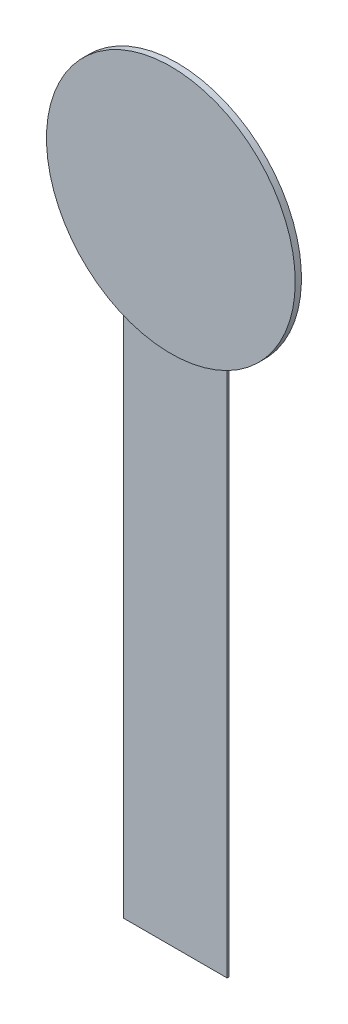
ISO-10303-21;
HEADER;
FILE_DESCRIPTION(('STEP AP214'),'2;1');
FILE_NAME('part.step','',(''),(''),'','','');
FILE_SCHEMA(('AUTOMOTIVE_DESIGN { 1 0 10303 214 1 1 1 1 }'));
ENDSEC;
DATA;
#1=APPLICATION_CONTEXT('core data for automotive mechanical design processes');
#2=APPLICATION_PROTOCOL_DEFINITION('international standard','automotive_design',2000,#1);
#3=PRODUCT_CONTEXT('',#1,'mechanical');
#4=PRODUCT('Part','Part','',(#3));
#5=PRODUCT_RELATED_PRODUCT_CATEGORY('part','',(#4));
#6=PRODUCT_DEFINITION_FORMATION('','',#4);
#7=PRODUCT_DEFINITION_CONTEXT('part definition',#1,'design');
#8=PRODUCT_DEFINITION('design','',#6,#7);
#9=PRODUCT_DEFINITION_SHAPE('','',#8);
#10=(LENGTH_UNIT() NAMED_UNIT(*) SI_UNIT(.MILLI.,.METRE.));
#11=(NAMED_UNIT(*) PLANE_ANGLE_UNIT() SI_UNIT($,.RADIAN.));
#12=(NAMED_UNIT(*) SI_UNIT($,.STERADIAN.) SOLID_ANGLE_UNIT());
#13=UNCERTAINTY_MEASURE_WITH_UNIT(LENGTH_MEASURE(1.E-05),#10,'distance_accuracy_value','');
#14=(GEOMETRIC_REPRESENTATION_CONTEXT(3) GLOBAL_UNCERTAINTY_ASSIGNED_CONTEXT((#13)) GLOBAL_UNIT_ASSIGNED_CONTEXT((#10,
#11,#12)) REPRESENTATION_CONTEXT('',''));
#15=CARTESIAN_POINT('',(0.,0.,0.));
#16=DIRECTION('',(0.,0.,1.));
#17=DIRECTION('',(1.,0.,0.));
#18=AXIS2_PLACEMENT_3D('',#15,#16,#17);
#19=CARTESIAN_POINT('',(0.,0.,0.46));
#20=DIRECTION('',(0.,0.,-1.));
#21=DIRECTION('',(-1.,0.,0.));
#22=AXIS2_PLACEMENT_3D('',#19,#20,#21);
#23=CYLINDRICAL_SURFACE('',#22,9.15);
#24=CARTESIAN_POINT('',(0.,0.,0.46));
#25=DIRECTION('',(0.,0.,1.));
#26=DIRECTION('',(1.,0.,0.));
#27=AXIS2_PLACEMENT_3D('',#24,#25,#26);
#28=CIRCLE('',#27,9.15);
#29=CARTESIAN_POINT('',(9.15,0.,0.46));
#30=VERTEX_POINT('',#29);
#31=EDGE_CURVE('E41',#30,#30,#28,.T.);
#32=ORIENTED_EDGE('',*,*,#31,.F.);
#33=EDGE_LOOP('',(#32));
#34=FACE_BOUND('',#33,.T.);
#35=DIRECTION('',(0.,0.,-1.));
#36=VECTOR('',#35,1.);
#37=CARTESIAN_POINT('',(-3.81,-8.31903840596977,0.13));
#38=LINE('',#37,#36);
#39=CARTESIAN_POINT('',(-3.80999999999999,-8.31903840596977,0.13));
#40=VERTEX_POINT('',#39);
#41=CARTESIAN_POINT('',(-3.80999999999999,-8.31903840596977,0.));
#42=VERTEX_POINT('',#41);
#43=EDGE_CURVE('E51',#40,#42,#38,.T.);
#44=ORIENTED_EDGE('',*,*,#43,.F.);
#45=CARTESIAN_POINT('',(0.,0.,0.13));
#46=DIRECTION('',(0.,0.,1.));
#47=DIRECTION('',(1.,0.,0.));
#48=AXIS2_PLACEMENT_3D('',#45,#46,#47);
#49=CIRCLE('',#48,9.15);
#50=CARTESIAN_POINT('',(3.81,-8.31903840596977,0.13));
#51=VERTEX_POINT('',#50);
#52=EDGE_CURVE('E11',#40,#51,#49,.T.);
#53=ORIENTED_EDGE('',*,*,#52,.T.);
#54=DIRECTION('',(0.,0.,-1.));
#55=VECTOR('',#54,1.);
#56=CARTESIAN_POINT('',(3.81,-8.31903840596977,0.13));
#57=LINE('',#56,#55);
#58=CARTESIAN_POINT('',(3.81,-8.31903840596977,0.));
#59=VERTEX_POINT('',#58);
#60=EDGE_CURVE('E94',#51,#59,#57,.T.);
#61=ORIENTED_EDGE('',*,*,#60,.T.);
#62=CARTESIAN_POINT('',(0.,0.,0.));
#63=DIRECTION('',(0.,0.,1.));
#64=DIRECTION('',(1.,0.,0.));
#65=AXIS2_PLACEMENT_3D('',#62,#63,#64);
#66=CIRCLE('',#65,9.15);
#67=EDGE_CURVE('E92',#59,#42,#66,.T.);
#68=ORIENTED_EDGE('',*,*,#67,.T.);
#69=EDGE_LOOP('',(#44,#53,#61,#68));
#70=FACE_BOUND('',#69,.T.);
#71=ADVANCED_FACE('F34',(#34,#70),#23,.T.);
#72=CARTESIAN_POINT('',(0.,0.,0.46));
#73=DIRECTION('',(0.,0.,1.));
#74=DIRECTION('',(1.,0.,0.));
#75=AXIS2_PLACEMENT_3D('',#72,#73,#74);
#76=PLANE('',#75);
#77=ORIENTED_EDGE('',*,*,#31,.T.);
#78=EDGE_LOOP('',(#77));
#79=FACE_BOUND('',#78,.T.);
#80=ADVANCED_FACE('F101',(#79),#76,.T.);
#81=CARTESIAN_POINT('',(0.,0.,0.));
#82=DIRECTION('',(0.,0.,1.));
#83=DIRECTION('',(1.,0.,0.));
#84=AXIS2_PLACEMENT_3D('',#81,#82,#83);
#85=PLANE('',#84);
#86=ORIENTED_EDGE('',*,*,#67,.F.);
#87=DIRECTION('',(0.,1.,0.));
#88=VECTOR('',#87,1.);
#89=CARTESIAN_POINT('',(3.81000000000001,-47.19,0.));
#90=LINE('',#89,#88);
#91=CARTESIAN_POINT('',(3.81000000000001,-47.19,0.));
#92=VERTEX_POINT('',#91);
#93=EDGE_CURVE('E87',#92,#59,#90,.T.);
#94=ORIENTED_EDGE('',*,*,#93,.F.);
#95=DIRECTION('',(1.,0.,0.));
#96=VECTOR('',#95,1.);
#97=CARTESIAN_POINT('',(-3.81,-47.19,0.));
#98=LINE('',#97,#96);
#99=CARTESIAN_POINT('',(-3.81,-47.19,0.));
#100=VERTEX_POINT('',#99);
#101=EDGE_CURVE('E167',#100,#92,#98,.T.);
#102=ORIENTED_EDGE('',*,*,#101,.F.);
#103=DIRECTION('',(0.,-1.,0.));
#104=VECTOR('',#103,1.);
#105=CARTESIAN_POINT('',(-3.81,-8.31903840596977,0.));
#106=LINE('',#105,#104);
#107=EDGE_CURVE('E91',#42,#100,#106,.T.);
#108=ORIENTED_EDGE('',*,*,#107,.F.);
#109=EDGE_LOOP('',(#86,#94,#102,#108));
#110=FACE_BOUND('',#109,.T.);
#111=ADVANCED_FACE('F107',(#110),#85,.F.);
#112=CARTESIAN_POINT('',(0.,0.,0.13));
#113=DIRECTION('',(0.,0.,1.));
#114=DIRECTION('',(1.,0.,0.));
#115=AXIS2_PLACEMENT_3D('',#112,#113,#114);
#116=PLANE('',#115);
#117=ORIENTED_EDGE('',*,*,#52,.F.);
#118=DIRECTION('',(0.,-1.,0.));
#119=VECTOR('',#118,1.);
#120=CARTESIAN_POINT('',(-3.81,-8.31903840596977,0.13));
#121=LINE('',#120,#119);
#122=CARTESIAN_POINT('',(-3.81,-47.19,0.13));
#123=VERTEX_POINT('',#122);
#124=EDGE_CURVE('E82',#40,#123,#121,.T.);
#125=ORIENTED_EDGE('',*,*,#124,.T.);
#126=DIRECTION('',(1.,0.,0.));
#127=VECTOR('',#126,1.);
#128=CARTESIAN_POINT('',(-3.81,-47.19,0.13));
#129=LINE('',#128,#127);
#130=CARTESIAN_POINT('',(3.81000000000001,-47.19,0.13));
#131=VERTEX_POINT('',#130);
#132=EDGE_CURVE('E71',#123,#131,#129,.T.);
#133=ORIENTED_EDGE('',*,*,#132,.T.);
#134=DIRECTION('',(0.,1.,0.));
#135=VECTOR('',#134,1.);
#136=CARTESIAN_POINT('',(3.81000000000001,-47.19,0.13));
#137=LINE('',#136,#135);
#138=EDGE_CURVE('E81',#131,#51,#137,.T.);
#139=ORIENTED_EDGE('',*,*,#138,.T.);
#140=EDGE_LOOP('',(#117,#125,#133,#139));
#141=FACE_BOUND('',#140,.T.);
#142=ADVANCED_FACE('F85',(#141),#116,.T.);
#143=CARTESIAN_POINT('',(-3.81,-8.31903840596977,0.13));
#144=DIRECTION('',(1.,0.,0.));
#145=DIRECTION('',(0.,1.,0.));
#146=AXIS2_PLACEMENT_3D('',#143,#144,#145);
#147=PLANE('',#146);
#148=ORIENTED_EDGE('',*,*,#107,.T.);
#149=DIRECTION('',(0.,0.,-1.));
#150=VECTOR('',#149,1.);
#151=CARTESIAN_POINT('',(-3.81,-47.19,0.13));
#152=LINE('',#151,#150);
#153=EDGE_CURVE('E75',#123,#100,#152,.T.);
#154=ORIENTED_EDGE('',*,*,#153,.F.);
#155=ORIENTED_EDGE('',*,*,#124,.F.);
#156=ORIENTED_EDGE('',*,*,#43,.T.);
#157=EDGE_LOOP('',(#148,#154,#155,#156));
#158=FACE_BOUND('',#157,.T.);
#159=ADVANCED_FACE('F89',(#158),#147,.F.);
#160=CARTESIAN_POINT('',(-3.81,-47.19,0.13));
#161=DIRECTION('',(0.,1.,0.));
#162=DIRECTION('',(0.,0.,1.));
#163=AXIS2_PLACEMENT_3D('',#160,#161,#162);
#164=PLANE('',#163);
#165=ORIENTED_EDGE('',*,*,#101,.T.);
#166=DIRECTION('',(0.,0.,-1.));
#167=VECTOR('',#166,1.);
#168=CARTESIAN_POINT('',(3.81000000000001,-47.19,0.13));
#169=LINE('',#168,#167);
#170=EDGE_CURVE('E78',#131,#92,#169,.T.);
#171=ORIENTED_EDGE('',*,*,#170,.F.);
#172=ORIENTED_EDGE('',*,*,#132,.F.);
#173=ORIENTED_EDGE('',*,*,#153,.T.);
#174=EDGE_LOOP('',(#165,#171,#172,#173));
#175=FACE_BOUND('',#174,.T.);
#176=ADVANCED_FACE('F73',(#175),#164,.F.);
#177=CARTESIAN_POINT('',(3.81000000000001,-47.19,0.13));
#178=DIRECTION('',(-1.,0.,0.));
#179=DIRECTION('',(0.,-1.,0.));
#180=AXIS2_PLACEMENT_3D('',#177,#178,#179);
#181=PLANE('',#180);
#182=ORIENTED_EDGE('',*,*,#93,.T.);
#183=ORIENTED_EDGE('',*,*,#60,.F.);
#184=ORIENTED_EDGE('',*,*,#138,.F.);
#185=ORIENTED_EDGE('',*,*,#170,.T.);
#186=EDGE_LOOP('',(#182,#183,#184,#185));
#187=FACE_BOUND('',#186,.T.);
#188=ADVANCED_FACE('F118',(#187),#181,.F.);
#189=CLOSED_SHELL('',(#71,#80,#111,#142,#159,#176,#188));
#190=MANIFOLD_SOLID_BREP('B2',#189);
#191=ADVANCED_BREP_SHAPE_REPRESENTATION('',(#18,#190),#14);
#192=SHAPE_DEFINITION_REPRESENTATION(#9,#191);
ENDSEC;
END-ISO-10303-21;
